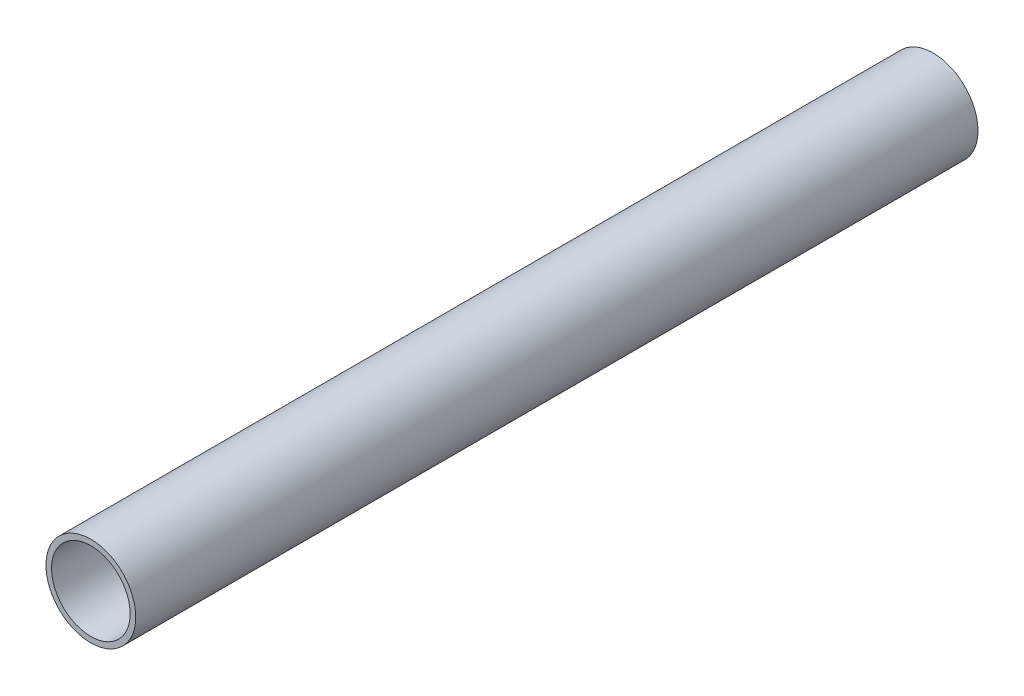
ISO-10303-21;
HEADER;
FILE_DESCRIPTION(('STEP AP214'),'2;1');
FILE_NAME('part.step','',(''),(''),'','','');
FILE_SCHEMA(('AUTOMOTIVE_DESIGN { 1 0 10303 214 1 1 1 1 }'));
ENDSEC;
DATA;
#1=APPLICATION_CONTEXT('core data for automotive mechanical design processes');
#2=APPLICATION_PROTOCOL_DEFINITION('international standard','automotive_design',2000,#1);
#3=PRODUCT_CONTEXT('',#1,'mechanical');
#4=PRODUCT('Part','Part','',(#3));
#5=PRODUCT_RELATED_PRODUCT_CATEGORY('part','',(#4));
#6=PRODUCT_DEFINITION_FORMATION('','',#4);
#7=PRODUCT_DEFINITION_CONTEXT('part definition',#1,'design');
#8=PRODUCT_DEFINITION('design','',#6,#7);
#9=PRODUCT_DEFINITION_SHAPE('','',#8);
#10=(LENGTH_UNIT() NAMED_UNIT(*) SI_UNIT(.MILLI.,.METRE.));
#11=(NAMED_UNIT(*) PLANE_ANGLE_UNIT() SI_UNIT($,.RADIAN.));
#12=(NAMED_UNIT(*) SI_UNIT($,.STERADIAN.) SOLID_ANGLE_UNIT());
#13=UNCERTAINTY_MEASURE_WITH_UNIT(LENGTH_MEASURE(1.E-05),#10,'distance_accuracy_value','');
#14=(GEOMETRIC_REPRESENTATION_CONTEXT(3) GLOBAL_UNCERTAINTY_ASSIGNED_CONTEXT((#13)) GLOBAL_UNIT_ASSIGNED_CONTEXT((#10,
#11,#12)) REPRESENTATION_CONTEXT('',''));
#15=CARTESIAN_POINT('',(0.,0.,0.));
#16=DIRECTION('',(0.,0.,1.));
#17=DIRECTION('',(1.,0.,0.));
#18=AXIS2_PLACEMENT_3D('',#15,#16,#17);
#19=CARTESIAN_POINT('',(0.,0.,150.));
#20=DIRECTION('',(0.,0.,1.));
#21=DIRECTION('',(1.,0.,0.));
#22=AXIS2_PLACEMENT_3D('',#19,#20,#21);
#23=PLANE('',#22);
#24=CARTESIAN_POINT('',(0.,0.,150.));
#25=DIRECTION('',(0.,0.,1.));
#26=DIRECTION('',(1.,0.,0.));
#27=AXIS2_PLACEMENT_3D('',#24,#25,#26);
#28=CIRCLE('',#27,8.);
#29=CARTESIAN_POINT('',(8.,0.,150.));
#30=VERTEX_POINT('',#29);
#31=EDGE_CURVE('E10',#30,#30,#28,.T.);
#32=ORIENTED_EDGE('',*,*,#31,.T.);
#33=EDGE_LOOP('',(#32));
#34=FACE_BOUND('',#33,.T.);
#35=CARTESIAN_POINT('',(0.,0.,150.));
#36=DIRECTION('',(0.,0.,1.));
#37=DIRECTION('',(1.,0.,0.));
#38=AXIS2_PLACEMENT_3D('',#35,#36,#37);
#39=CIRCLE('',#38,7.);
#40=CARTESIAN_POINT('',(7.,0.,150.));
#41=VERTEX_POINT('',#40);
#42=EDGE_CURVE('E39',#41,#41,#39,.T.);
#43=ORIENTED_EDGE('',*,*,#42,.F.);
#44=EDGE_LOOP('',(#43));
#45=FACE_BOUND('',#44,.T.);
#46=ADVANCED_FACE('F28',(#34,#45),#23,.T.);
#47=CARTESIAN_POINT('',(0.,0.,0.));
#48=DIRECTION('',(0.,0.,1.));
#49=DIRECTION('',(1.,0.,0.));
#50=AXIS2_PLACEMENT_3D('',#47,#48,#49);
#51=PLANE('',#50);
#52=CARTESIAN_POINT('',(0.,0.,0.));
#53=DIRECTION('',(0.,0.,1.));
#54=DIRECTION('',(1.,0.,0.));
#55=AXIS2_PLACEMENT_3D('',#52,#53,#54);
#56=CIRCLE('',#55,8.);
#57=CARTESIAN_POINT('',(8.,0.,0.));
#58=VERTEX_POINT('',#57);
#59=EDGE_CURVE('E32',#58,#58,#56,.T.);
#60=ORIENTED_EDGE('',*,*,#59,.F.);
#61=EDGE_LOOP('',(#60));
#62=FACE_BOUND('',#61,.T.);
#63=CARTESIAN_POINT('',(0.,0.,0.));
#64=DIRECTION('',(0.,0.,1.));
#65=DIRECTION('',(1.,0.,0.));
#66=AXIS2_PLACEMENT_3D('',#63,#64,#65);
#67=CIRCLE('',#66,7.);
#68=CARTESIAN_POINT('',(7.,0.,0.));
#69=VERTEX_POINT('',#68);
#70=EDGE_CURVE('E41',#69,#69,#67,.T.);
#71=ORIENTED_EDGE('',*,*,#70,.T.);
#72=EDGE_LOOP('',(#71));
#73=FACE_BOUND('',#72,.T.);
#74=ADVANCED_FACE('F51',(#62,#73),#51,.F.);
#75=CARTESIAN_POINT('',(0.,0.,150.));
#76=DIRECTION('',(0.,0.,-1.));
#77=DIRECTION('',(-1.,0.,0.));
#78=AXIS2_PLACEMENT_3D('',#75,#76,#77);
#79=CYLINDRICAL_SURFACE('',#78,8.);
#80=ORIENTED_EDGE('',*,*,#31,.F.);
#81=EDGE_LOOP('',(#80));
#82=FACE_BOUND('',#81,.T.);
#83=ORIENTED_EDGE('',*,*,#59,.T.);
#84=EDGE_LOOP('',(#83));
#85=FACE_BOUND('',#84,.T.);
#86=ADVANCED_FACE('F30',(#82,#85),#79,.T.);
#87=CARTESIAN_POINT('',(0.,0.,150.));
#88=DIRECTION('',(0.,0.,-1.));
#89=DIRECTION('',(-1.,0.,0.));
#90=AXIS2_PLACEMENT_3D('',#87,#88,#89);
#91=CYLINDRICAL_SURFACE('',#90,7.);
#92=ORIENTED_EDGE('',*,*,#42,.T.);
#93=EDGE_LOOP('',(#92));
#94=FACE_BOUND('',#93,.T.);
#95=ORIENTED_EDGE('',*,*,#70,.F.);
#96=EDGE_LOOP('',(#95));
#97=FACE_BOUND('',#96,.T.);
#98=ADVANCED_FACE('F47',(#94,#97),#91,.F.);
#99=CLOSED_SHELL('',(#46,#74,#86,#98));
#100=MANIFOLD_SOLID_BREP('B2',#99);
#101=ADVANCED_BREP_SHAPE_REPRESENTATION('',(#18,#100),#14);
#102=SHAPE_DEFINITION_REPRESENTATION(#9,#101);
ENDSEC;
END-ISO-10303-21;
